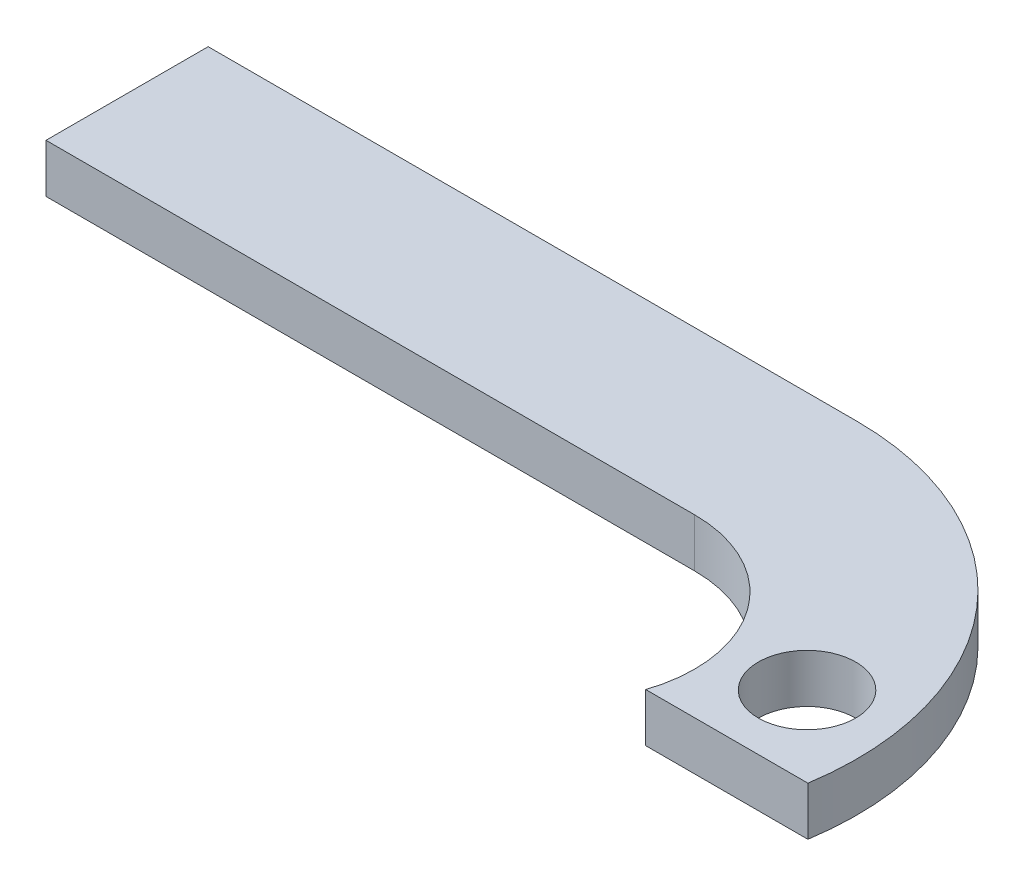
ISO-10303-21;
HEADER;
FILE_DESCRIPTION(('STEP AP214'),'2;1');
FILE_NAME('part.step','',(''),(''),'','','');
FILE_SCHEMA(('AUTOMOTIVE_DESIGN { 1 0 10303 214 1 1 1 1 }'));
ENDSEC;
DATA;
#1=APPLICATION_CONTEXT('core data for automotive mechanical design processes');
#2=APPLICATION_PROTOCOL_DEFINITION('international standard','automotive_design',2000,#1);
#3=PRODUCT_CONTEXT('',#1,'mechanical');
#4=PRODUCT('Part','Part','',(#3));
#5=PRODUCT_RELATED_PRODUCT_CATEGORY('part','',(#4));
#6=PRODUCT_DEFINITION_FORMATION('','',#4);
#7=PRODUCT_DEFINITION_CONTEXT('part definition',#1,'design');
#8=PRODUCT_DEFINITION('design','',#6,#7);
#9=PRODUCT_DEFINITION_SHAPE('','',#8);
#10=(LENGTH_UNIT() NAMED_UNIT(*) SI_UNIT(.MILLI.,.METRE.));
#11=(NAMED_UNIT(*) PLANE_ANGLE_UNIT() SI_UNIT($,.RADIAN.));
#12=(NAMED_UNIT(*) SI_UNIT($,.STERADIAN.) SOLID_ANGLE_UNIT());
#13=UNCERTAINTY_MEASURE_WITH_UNIT(LENGTH_MEASURE(1.E-05),#10,'distance_accuracy_value','');
#14=(GEOMETRIC_REPRESENTATION_CONTEXT(3) GLOBAL_UNCERTAINTY_ASSIGNED_CONTEXT((#13)) GLOBAL_UNIT_ASSIGNED_CONTEXT((#10,
#11,#12)) REPRESENTATION_CONTEXT('',''));
#15=CARTESIAN_POINT('',(0.,0.,0.));
#16=DIRECTION('',(0.,0.,1.));
#17=DIRECTION('',(1.,0.,0.));
#18=AXIS2_PLACEMENT_3D('',#15,#16,#17);
#19=CARTESIAN_POINT('',(0.,15.,50.));
#20=DIRECTION('',(0.,0.,-1.));
#21=DIRECTION('',(-1.,0.,0.));
#22=AXIS2_PLACEMENT_3D('',#19,#20,#21);
#23=PLANE('',#22);
#24=DIRECTION('',(1.,0.,0.));
#25=VECTOR('',#24,1.);
#26=CARTESIAN_POINT('',(0.,0.,50.));
#27=LINE('',#26,#25);
#28=CARTESIAN_POINT('',(0.,0.,50.));
#29=VERTEX_POINT('',#28);
#30=CARTESIAN_POINT('',(200.,0.,50.));
#31=VERTEX_POINT('',#30);
#32=EDGE_CURVE('E129',#29,#31,#27,.T.);
#33=ORIENTED_EDGE('',*,*,#32,.T.);
#34=DIRECTION('',(0.,-1.,0.));
#35=VECTOR('',#34,1.);
#36=CARTESIAN_POINT('',(200.,15.,50.));
#37=LINE('',#36,#35);
#38=CARTESIAN_POINT('',(200.,15.,50.));
#39=VERTEX_POINT('',#38);
#40=EDGE_CURVE('E11',#39,#31,#37,.T.);
#41=ORIENTED_EDGE('',*,*,#40,.F.);
#42=DIRECTION('',(1.,0.,0.));
#43=VECTOR('',#42,1.);
#44=CARTESIAN_POINT('',(0.,15.,50.));
#45=LINE('',#44,#43);
#46=CARTESIAN_POINT('',(0.,15.,50.));
#47=VERTEX_POINT('',#46);
#48=EDGE_CURVE('E148',#47,#39,#45,.T.);
#49=ORIENTED_EDGE('',*,*,#48,.F.);
#50=DIRECTION('',(0.,-1.,0.));
#51=VECTOR('',#50,1.);
#52=CARTESIAN_POINT('',(0.,15.,50.));
#53=LINE('',#52,#51);
#54=EDGE_CURVE('E125',#47,#29,#53,.T.);
#55=ORIENTED_EDGE('',*,*,#54,.T.);
#56=EDGE_LOOP('',(#33,#41,#49,#55));
#57=FACE_BOUND('',#56,.T.);
#58=ADVANCED_FACE('F41',(#57),#23,.F.);
#59=CARTESIAN_POINT('',(200.,15.,91.2217842784438));
#60=DIRECTION('',(0.,-1.,0.));
#61=DIRECTION('',(0.,0.,-1.));
#62=AXIS2_PLACEMENT_3D('',#59,#60,#61);
#63=CYLINDRICAL_SURFACE('',#62,41.2217842784438);
#64=CARTESIAN_POINT('',(200.,0.,91.2217842784438));
#65=DIRECTION('',(0.,1.,0.));
#66=DIRECTION('',(0.,0.,1.));
#67=AXIS2_PLACEMENT_3D('',#64,#65,#66);
#68=CIRCLE('',#67,41.2217842784438);
#69=CARTESIAN_POINT('',(239.124306245704,0.,104.203469835063));
#70=VERTEX_POINT('',#69);
#71=EDGE_CURVE('E133',#31,#70,#68,.F.);
#72=ORIENTED_EDGE('',*,*,#71,.T.);
#73=DIRECTION('',(0.,-1.,0.));
#74=VECTOR('',#73,1.);
#75=CARTESIAN_POINT('',(239.124306245704,15.,104.203469835063));
#76=LINE('',#75,#74);
#77=CARTESIAN_POINT('',(239.124306245704,15.,104.203469835063));
#78=VERTEX_POINT('',#77);
#79=EDGE_CURVE('E51',#78,#70,#76,.T.);
#80=ORIENTED_EDGE('',*,*,#79,.F.);
#81=CARTESIAN_POINT('',(200.,15.,91.2217842784438));
#82=DIRECTION('',(0.,1.,0.));
#83=DIRECTION('',(0.,0.,1.));
#84=AXIS2_PLACEMENT_3D('',#81,#82,#83);
#85=CIRCLE('',#84,41.2217842784438);
#86=EDGE_CURVE('E92',#39,#78,#85,.F.);
#87=ORIENTED_EDGE('',*,*,#86,.F.);
#88=ORIENTED_EDGE('',*,*,#40,.T.);
#89=EDGE_LOOP('',(#72,#80,#87,#88));
#90=FACE_BOUND('',#89,.T.);
#91=ADVANCED_FACE('F159',(#90),#63,.F.);
#92=CARTESIAN_POINT('',(0.,15.,104.203469835063));
#93=DIRECTION('',(0.,0.,1.));
#94=DIRECTION('',(1.,0.,0.));
#95=AXIS2_PLACEMENT_3D('',#92,#93,#94);
#96=PLANE('',#95);
#97=DIRECTION('',(-1.,0.,0.));
#98=VECTOR('',#97,1.);
#99=CARTESIAN_POINT('',(0.,0.,104.203469835063));
#100=LINE('',#99,#98);
#101=CARTESIAN_POINT('',(289.124306245704,0.,104.203469835063));
#102=VERTEX_POINT('',#101);
#103=EDGE_CURVE('E137',#102,#70,#100,.T.);
#104=ORIENTED_EDGE('',*,*,#103,.F.);
#105=DIRECTION('',(0.,-1.,0.));
#106=VECTOR('',#105,1.);
#107=CARTESIAN_POINT('',(289.124306245704,15.,104.203469835063));
#108=LINE('',#107,#106);
#109=CARTESIAN_POINT('',(289.124306245704,15.,104.203469835063));
#110=VERTEX_POINT('',#109);
#111=EDGE_CURVE('E112',#110,#102,#108,.T.);
#112=ORIENTED_EDGE('',*,*,#111,.F.);
#113=DIRECTION('',(-1.,0.,0.));
#114=VECTOR('',#113,1.);
#115=CARTESIAN_POINT('',(0.,15.,104.203469835063));
#116=LINE('',#115,#114);
#117=EDGE_CURVE('E118',#110,#78,#116,.T.);
#118=ORIENTED_EDGE('',*,*,#117,.T.);
#119=ORIENTED_EDGE('',*,*,#79,.T.);
#120=EDGE_LOOP('',(#104,#112,#118,#119));
#121=FACE_BOUND('',#120,.T.);
#122=ADVANCED_FACE('F158',(#121),#96,.T.);
#123=CARTESIAN_POINT('',(200.,15.,90.2153504062992));
#124=DIRECTION('',(0.,-1.,0.));
#125=DIRECTION('',(0.,0.,-1.));
#126=AXIS2_PLACEMENT_3D('',#123,#124,#125);
#127=CYLINDRICAL_SURFACE('',#126,90.2153504062992);
#128=CARTESIAN_POINT('',(200.,0.,90.2153504062992));
#129=DIRECTION('',(0.,1.,0.));
#130=DIRECTION('',(0.,0.,1.));
#131=AXIS2_PLACEMENT_3D('',#128,#129,#130);
#132=CIRCLE('',#131,90.2153504062992);
#133=CARTESIAN_POINT('',(200.,0.,0.));
#134=VERTEX_POINT('',#133);
#135=EDGE_CURVE('E106',#134,#102,#132,.F.);
#136=ORIENTED_EDGE('',*,*,#135,.F.);
#137=DIRECTION('',(0.,-1.,0.));
#138=VECTOR('',#137,1.);
#139=CARTESIAN_POINT('',(200.,15.,0.));
#140=LINE('',#139,#138);
#141=CARTESIAN_POINT('',(200.,15.,0.));
#142=VERTEX_POINT('',#141);
#143=EDGE_CURVE('E101',#142,#134,#140,.T.);
#144=ORIENTED_EDGE('',*,*,#143,.F.);
#145=CARTESIAN_POINT('',(200.,15.,90.2153504062992));
#146=DIRECTION('',(0.,1.,0.));
#147=DIRECTION('',(0.,0.,1.));
#148=AXIS2_PLACEMENT_3D('',#145,#146,#147);
#149=CIRCLE('',#148,90.2153504062992);
#150=EDGE_CURVE('E104',#142,#110,#149,.F.);
#151=ORIENTED_EDGE('',*,*,#150,.T.);
#152=ORIENTED_EDGE('',*,*,#111,.T.);
#153=EDGE_LOOP('',(#136,#144,#151,#152));
#154=FACE_BOUND('',#153,.T.);
#155=ADVANCED_FACE('F103',(#154),#127,.T.);
#156=CARTESIAN_POINT('',(0.,15.,0.));
#157=DIRECTION('',(0.,0.,-1.));
#158=DIRECTION('',(-1.,0.,0.));
#159=AXIS2_PLACEMENT_3D('',#156,#157,#158);
#160=PLANE('',#159);
#161=DIRECTION('',(1.,0.,0.));
#162=VECTOR('',#161,1.);
#163=CARTESIAN_POINT('',(0.,0.,0.));
#164=LINE('',#163,#162);
#165=CARTESIAN_POINT('',(0.,0.,0.));
#166=VERTEX_POINT('',#165);
#167=EDGE_CURVE('E143',#166,#134,#164,.T.);
#168=ORIENTED_EDGE('',*,*,#167,.F.);
#169=DIRECTION('',(0.,-1.,0.));
#170=VECTOR('',#169,1.);
#171=CARTESIAN_POINT('',(0.,15.,0.));
#172=LINE('',#171,#170);
#173=CARTESIAN_POINT('',(0.,15.,0.));
#174=VERTEX_POINT('',#173);
#175=EDGE_CURVE('E81',#174,#166,#172,.T.);
#176=ORIENTED_EDGE('',*,*,#175,.F.);
#177=DIRECTION('',(1.,0.,0.));
#178=VECTOR('',#177,1.);
#179=CARTESIAN_POINT('',(0.,15.,0.));
#180=LINE('',#179,#178);
#181=EDGE_CURVE('E116',#174,#142,#180,.T.);
#182=ORIENTED_EDGE('',*,*,#181,.T.);
#183=ORIENTED_EDGE('',*,*,#143,.T.);
#184=EDGE_LOOP('',(#168,#176,#182,#183));
#185=FACE_BOUND('',#184,.T.);
#186=ADVANCED_FACE('F121',(#185),#160,.T.);
#187=CARTESIAN_POINT('',(0.,15.,0.));
#188=DIRECTION('',(1.,0.,0.));
#189=DIRECTION('',(0.,0.,-1.));
#190=AXIS2_PLACEMENT_3D('',#187,#188,#189);
#191=PLANE('',#190);
#192=DIRECTION('',(0.,0.,1.));
#193=VECTOR('',#192,1.);
#194=CARTESIAN_POINT('',(0.,0.,0.));
#195=LINE('',#194,#193);
#196=EDGE_CURVE('E84',#166,#29,#195,.T.);
#197=ORIENTED_EDGE('',*,*,#196,.T.);
#198=ORIENTED_EDGE('',*,*,#54,.F.);
#199=DIRECTION('',(0.,0.,1.));
#200=VECTOR('',#199,1.);
#201=CARTESIAN_POINT('',(0.,15.,0.));
#202=LINE('',#201,#200);
#203=EDGE_CURVE('E59',#174,#47,#202,.T.);
#204=ORIENTED_EDGE('',*,*,#203,.F.);
#205=ORIENTED_EDGE('',*,*,#175,.T.);
#206=EDGE_LOOP('',(#197,#198,#204,#205));
#207=FACE_BOUND('',#206,.T.);
#208=ADVANCED_FACE('F166',(#207),#191,.F.);
#209=CARTESIAN_POINT('',(0.,15.,0.));
#210=DIRECTION('',(0.,1.,0.));
#211=DIRECTION('',(0.,0.,1.));
#212=AXIS2_PLACEMENT_3D('',#209,#210,#211);
#213=PLANE('',#212);
#214=CARTESIAN_POINT('',(264.124306245704,15.,79.466665474565));
#215=DIRECTION('',(0.,1.,0.));
#216=DIRECTION('',(0.,0.,1.));
#217=AXIS2_PLACEMENT_3D('',#214,#215,#216);
#218=CIRCLE('',#217,15.);
#219=CARTESIAN_POINT('',(264.124306245704,15.,94.4666654745651));
#220=VERTEX_POINT('',#219);
#221=EDGE_CURVE('E231',#220,#220,#218,.T.);
#222=ORIENTED_EDGE('',*,*,#221,.F.);
#223=EDGE_LOOP('',(#222));
#224=FACE_BOUND('',#223,.T.);
#225=ORIENTED_EDGE('',*,*,#48,.T.);
#226=ORIENTED_EDGE('',*,*,#86,.T.);
#227=ORIENTED_EDGE('',*,*,#117,.F.);
#228=ORIENTED_EDGE('',*,*,#150,.F.);
#229=ORIENTED_EDGE('',*,*,#181,.F.);
#230=ORIENTED_EDGE('',*,*,#203,.T.);
#231=EDGE_LOOP('',(#225,#226,#227,#228,#229,#230));
#232=FACE_BOUND('',#231,.T.);
#233=ADVANCED_FACE('F115',(#224,#232),#213,.T.);
#234=CARTESIAN_POINT('',(0.,0.,0.));
#235=DIRECTION('',(0.,1.,0.));
#236=DIRECTION('',(0.,0.,1.));
#237=AXIS2_PLACEMENT_3D('',#234,#235,#236);
#238=PLANE('',#237);
#239=CARTESIAN_POINT('',(264.124306245704,0.,79.466665474565));
#240=DIRECTION('',(0.,1.,0.));
#241=DIRECTION('',(0.,0.,1.));
#242=AXIS2_PLACEMENT_3D('',#239,#240,#241);
#243=CIRCLE('',#242,15.);
#244=CARTESIAN_POINT('',(264.124306245704,0.,94.4666654745651));
#245=VERTEX_POINT('',#244);
#246=EDGE_CURVE('E44',#245,#245,#243,.T.);
#247=ORIENTED_EDGE('',*,*,#246,.T.);
#248=EDGE_LOOP('',(#247));
#249=FACE_BOUND('',#248,.T.);
#250=ORIENTED_EDGE('',*,*,#32,.F.);
#251=ORIENTED_EDGE('',*,*,#196,.F.);
#252=ORIENTED_EDGE('',*,*,#167,.T.);
#253=ORIENTED_EDGE('',*,*,#135,.T.);
#254=ORIENTED_EDGE('',*,*,#103,.T.);
#255=ORIENTED_EDGE('',*,*,#71,.F.);
#256=EDGE_LOOP('',(#250,#251,#252,#253,#254,#255));
#257=FACE_BOUND('',#256,.T.);
#258=ADVANCED_FACE('F163',(#249,#257),#238,.F.);
#259=CARTESIAN_POINT('',(264.124306245704,-16.,79.466665474565));
#260=DIRECTION('',(0.,1.,0.));
#261=DIRECTION('',(0.,0.,1.));
#262=AXIS2_PLACEMENT_3D('',#259,#260,#261);
#263=CYLINDRICAL_SURFACE('',#262,15.);
#264=ORIENTED_EDGE('',*,*,#221,.T.);
#265=EDGE_LOOP('',(#264));
#266=FACE_BOUND('',#265,.T.);
#267=ORIENTED_EDGE('',*,*,#246,.F.);
#268=EDGE_LOOP('',(#267));
#269=FACE_BOUND('',#268,.T.);
#270=ADVANCED_FACE('F215',(#266,#269),#263,.F.);
#271=CLOSED_SHELL('',(#58,#91,#122,#155,#186,#208,#233,#258,#270));
#272=MANIFOLD_SOLID_BREP('B2',#271);
#273=ADVANCED_BREP_SHAPE_REPRESENTATION('',(#18,#272),#14);
#274=SHAPE_DEFINITION_REPRESENTATION(#9,#273);
ENDSEC;
END-ISO-10303-21;
